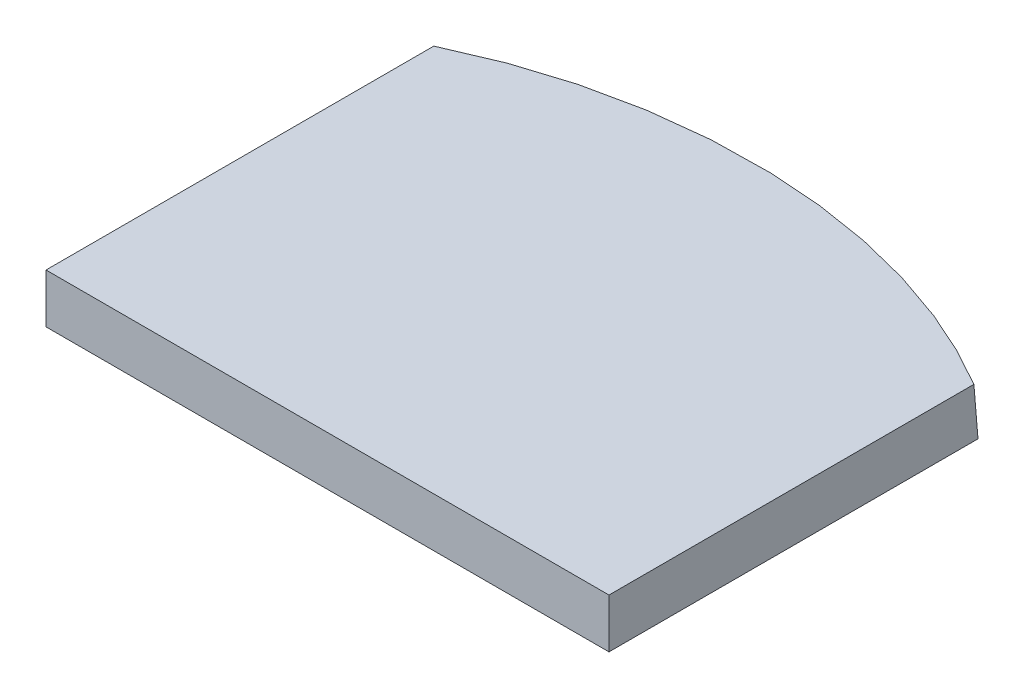
ISO-10303-21;
HEADER;
FILE_DESCRIPTION(('STEP AP214'),'2;1');
FILE_NAME('part.step','',(''),(''),'','','');
FILE_SCHEMA(('AUTOMOTIVE_DESIGN { 1 0 10303 214 1 1 1 1 }'));
ENDSEC;
DATA;
#1=APPLICATION_CONTEXT('core data for automotive mechanical design processes');
#2=APPLICATION_PROTOCOL_DEFINITION('international standard','automotive_design',2000,#1);
#3=PRODUCT_CONTEXT('',#1,'mechanical');
#4=PRODUCT('Part','Part','',(#3));
#5=PRODUCT_RELATED_PRODUCT_CATEGORY('part','',(#4));
#6=PRODUCT_DEFINITION_FORMATION('','',#4);
#7=PRODUCT_DEFINITION_CONTEXT('part definition',#1,'design');
#8=PRODUCT_DEFINITION('design','',#6,#7);
#9=PRODUCT_DEFINITION_SHAPE('','',#8);
#10=(LENGTH_UNIT() NAMED_UNIT(*) SI_UNIT(.MILLI.,.METRE.));
#11=(NAMED_UNIT(*) PLANE_ANGLE_UNIT() SI_UNIT($,.RADIAN.));
#12=(NAMED_UNIT(*) SI_UNIT($,.STERADIAN.) SOLID_ANGLE_UNIT());
#13=UNCERTAINTY_MEASURE_WITH_UNIT(LENGTH_MEASURE(1.E-05),#10,'distance_accuracy_value','');
#14=(GEOMETRIC_REPRESENTATION_CONTEXT(3) GLOBAL_UNCERTAINTY_ASSIGNED_CONTEXT((#13)) GLOBAL_UNIT_ASSIGNED_CONTEXT((#10,
#11,#12)) REPRESENTATION_CONTEXT('',''));
#15=CARTESIAN_POINT('',(0.,0.,0.));
#16=DIRECTION('',(0.,0.,1.));
#17=DIRECTION('',(1.,0.,0.));
#18=AXIS2_PLACEMENT_3D('',#15,#16,#17);
#19=CARTESIAN_POINT('',(21.5,-176.5,20.8978327647945));
#20=DIRECTION('',(-1.,0.,0.));
#21=DIRECTION('',(0.,-1.,0.));
#22=AXIS2_PLACEMENT_3D('',#19,#20,#21);
#23=PLANE('',#22);
#24=CARTESIAN_POINT('',(21.5000000000001,-190.,-26.2183108193915));
#25=CARTESIAN_POINT('',(21.5000000000001,-189.416665155996,-26.169727993826));
#26=CARTESIAN_POINT('',(21.5000000000001,-188.833331067328,-26.1211361023456));
#27=CARTESIAN_POINT('',(21.5,-187.666664400661,-26.0239341875551));
#28=CARTESIAN_POINT('',(21.5,-187.083331822663,-25.975324164245));
#29=CARTESIAN_POINT('',(21.5,-186.5,-25.92670507502));
#30=B_SPLINE_CURVE_WITH_KNOTS('',3,(#24,#25,#26,#27,#28,#29),.UNSPECIFIED.,.F.,.F.,(4,2,4),(0.,
1.7560633468877,3.51212669377542),.UNSPECIFIED.);
#31=CARTESIAN_POINT('',(21.4999994350566,-190.,-26.2183124401896));
#32=VERTEX_POINT('',#31);
#33=CARTESIAN_POINT('',(21.5,-186.5,-25.92670507502));
#34=VERTEX_POINT('',#33);
#35=EDGE_CURVE('E118',#32,#34,#30,.T.);
#36=ORIENTED_EDGE('',*,*,#35,.T.);
#37=DIRECTION('',(0.,0.,-1.));
#38=VECTOR('',#37,1.);
#39=CARTESIAN_POINT('',(21.5,-186.5,20.8978327647945));
#40=LINE('',#39,#38);
#41=CARTESIAN_POINT('',(21.5000000005769,-186.5,0.));
#42=VERTEX_POINT('',#41);
#43=EDGE_CURVE('E11',#42,#34,#40,.T.);
#44=ORIENTED_EDGE('',*,*,#43,.F.);
#45=DIRECTION('',(0.,-1.,0.));
#46=VECTOR('',#45,1.);
#47=CARTESIAN_POINT('',(21.4999999999996,0.,0.));
#48=LINE('',#47,#46);
#49=CARTESIAN_POINT('',(21.5,-190.,0.));
#50=VERTEX_POINT('',#49);
#51=EDGE_CURVE('E48',#42,#50,#48,.T.);
#52=ORIENTED_EDGE('',*,*,#51,.T.);
#53=DIRECTION('',(0.,0.,1.));
#54=VECTOR('',#53,1.);
#55=CARTESIAN_POINT('',(21.5000000000001,-190.,0.));
#56=LINE('',#55,#54);
#57=EDGE_CURVE('E62',#32,#50,#56,.T.);
#58=ORIENTED_EDGE('',*,*,#57,.F.);
#59=EDGE_LOOP('',(#36,#44,#52,#58));
#60=FACE_BOUND('',#59,.T.);
#61=ADVANCED_FACE('F43',(#60),#23,.F.);
#62=CARTESIAN_POINT('',(-18.5,-156.5,21.131836958515));
#63=DIRECTION('',(-1.,0.,0.));
#64=DIRECTION('',(0.,0.,1.));
#65=AXIS2_PLACEMENT_3D('',#62,#63,#64);
#66=PLANE('',#65);
#67=CARTESIAN_POINT('',(-18.5,-190.,-27.8348909743788));
#68=CARTESIAN_POINT('',(-18.5,-188.833333333333,-27.7406024281379));
#69=CARTESIAN_POINT('',(-18.5,-187.666666666667,-27.646313881897));
#70=CARTESIAN_POINT('',(-18.5,-186.5,-27.552025335656));
#71=B_SPLINE_CURVE_WITH_KNOTS('',3,(#67,#68,#69,#70),.UNSPECIFIED.,.F.,.F.,(4,4),(0.,
3.51141181999062),.UNSPECIFIED.);
#72=CARTESIAN_POINT('',(-18.4999996475401,-190.,-27.8348920437937));
#73=VERTEX_POINT('',#72);
#74=CARTESIAN_POINT('',(-18.5,-186.5,-27.552025335656));
#75=VERTEX_POINT('',#74);
#76=EDGE_CURVE('E121',#73,#75,#71,.T.);
#77=ORIENTED_EDGE('',*,*,#76,.F.);
#78=DIRECTION('',(0.,0.,1.));
#79=VECTOR('',#78,1.);
#80=CARTESIAN_POINT('',(-18.5,-190.,0.));
#81=LINE('',#80,#79);
#82=CARTESIAN_POINT('',(-18.5,-190.,0.));
#83=VERTEX_POINT('',#82);
#84=EDGE_CURVE('E101',#73,#83,#81,.T.);
#85=ORIENTED_EDGE('',*,*,#84,.T.);
#86=DIRECTION('',(0.,-1.,0.));
#87=VECTOR('',#86,1.);
#88=CARTESIAN_POINT('',(-18.5,0.,0.));
#89=LINE('',#88,#87);
#90=CARTESIAN_POINT('',(-18.5,-186.5,0.));
#91=VERTEX_POINT('',#90);
#92=EDGE_CURVE('E99',#91,#83,#89,.T.);
#93=ORIENTED_EDGE('',*,*,#92,.F.);
#94=DIRECTION('',(0.,0.,-1.));
#95=VECTOR('',#94,1.);
#96=CARTESIAN_POINT('',(-18.5,-186.5,19.475725904499));
#97=LINE('',#96,#95);
#98=EDGE_CURVE('E81',#91,#75,#97,.T.);
#99=ORIENTED_EDGE('',*,*,#98,.T.);
#100=EDGE_LOOP('',(#77,#85,#93,#99));
#101=FACE_BOUND('',#100,.T.);
#102=ADVANCED_FACE('F105',(#101),#66,.T.);
#103=CARTESIAN_POINT('',(0.,0.,0.));
#104=DIRECTION('',(0.,0.,1.));
#105=DIRECTION('',(1.,0.,0.));
#106=AXIS2_PLACEMENT_3D('',#103,#104,#105);
#107=PLANE('',#106);
#108=ORIENTED_EDGE('',*,*,#92,.T.);
#109=DIRECTION('',(1.,0.,0.));
#110=VECTOR('',#109,1.);
#111=CARTESIAN_POINT('',(0.,-190.,0.));
#112=LINE('',#111,#110);
#113=EDGE_CURVE('E93',#83,#50,#112,.T.);
#114=ORIENTED_EDGE('',*,*,#113,.T.);
#115=ORIENTED_EDGE('',*,*,#51,.F.);
#116=DIRECTION('',(1.,0.,0.));
#117=VECTOR('',#116,1.);
#118=CARTESIAN_POINT('',(0.,-186.5,0.));
#119=LINE('',#118,#117);
#120=EDGE_CURVE('E86',#91,#42,#119,.T.);
#121=ORIENTED_EDGE('',*,*,#120,.F.);
#122=EDGE_LOOP('',(#108,#114,#115,#121));
#123=FACE_BOUND('',#122,.T.);
#124=ADVANCED_FACE('F97',(#123),#107,.T.);
#125=CARTESIAN_POINT('',(0.086150742203567,-186.5,-28.2226236497702));
#126=DIRECTION('',(0.,1.,0.));
#127=DIRECTION('',(0.,0.,1.));
#128=AXIS2_PLACEMENT_3D('',#125,#126,#127);
#129=PLANE('',#128);
#130=CARTESIAN_POINT('',(-18.5,-186.5,-27.552025335656));
#131=CARTESIAN_POINT('',(-17.9834971819987,-186.5,-27.8031883249195));
#132=CARTESIAN_POINT('',(-17.46158288979,-186.5,-28.0430399326112));
#133=CARTESIAN_POINT('',(-16.4080778352532,-186.5,-28.5000670255763));
#134=CARTESIAN_POINT('',(-15.8764896431985,-186.5,-28.7172484337435));
#135=CARTESIAN_POINT('',(-14.2691295982034,-186.5,-29.3346626366866));
#136=CARTESIAN_POINT('',(-13.1801752516849,-186.5,-29.7010497160131));
#137=CARTESIAN_POINT('',(-10.9765888879245,-186.5,-30.3430838196725));
#138=CARTESIAN_POINT('',(-9.86197162574349,-186.5,-30.6187816579454));
#139=CARTESIAN_POINT('',(-8.17622120811546,-186.5,-30.9645975513845));
#140=CARTESIAN_POINT('',(-7.61185066737096,-186.5,-31.0685994012236));
#141=CARTESIAN_POINT('',(-6.47928085674553,-186.5,-31.2540516079508));
#142=CARTESIAN_POINT('',(-5.91108071822283,-186.5,-31.3354966591282));
#143=CARTESIAN_POINT('',(-4.17954070251019,-186.5,-31.5487701514934));
#144=CARTESIAN_POINT('',(-3.01163026901751,-186.5,-31.644944999237));
#145=CARTESIAN_POINT('',(-0.671827155307275,-186.5,-31.7434024046366));
#146=CARTESIAN_POINT('',(0.500065662985438,-186.5,-31.7456816728824));
#147=CARTESIAN_POINT('',(2.25483993137703,-186.5,-31.678728496834));
#148=CARTESIAN_POINT('',(2.83924686846808,-186.5,-31.6446829222743));
#149=CARTESIAN_POINT('',(4.00607310275159,-186.5,-31.5531403371392));
#150=CARTESIAN_POINT('',(4.58849295282674,-186.5,-31.4956504970563));
#151=CARTESIAN_POINT('',(5.75056259078612,-186.5,-31.3572029737904));
#152=CARTESIAN_POINT('',(6.33021226638889,-186.5,-31.2762443474282));
#153=CARTESIAN_POINT('',(7.48589273767048,-186.5,-31.0908261739034));
#154=CARTESIAN_POINT('',(8.0619223679602,-186.5,-30.9863594209952));
#155=CARTESIAN_POINT('',(9.76534074123102,-186.5,-30.6412399040868));
#156=CARTESIAN_POINT('',(10.8860612762541,-186.5,-30.3667208242584));
#157=CARTESIAN_POINT('',(13.1011223398577,-186.5,-29.7263534466765));
#158=CARTESIAN_POINT('',(14.1954644150943,-186.5,-29.3605105178949));
#159=CARTESIAN_POINT('',(15.8116745315898,-186.5,-28.7430031025506));
#160=CARTESIAN_POINT('',(16.3467646670301,-186.5,-28.5254347696975));
#161=CARTESIAN_POINT('',(17.4069299603634,-186.5,-28.0674838205188));
#162=CARTESIAN_POINT('',(17.9320082904271,-186.5,-27.8271085796644));
#163=CARTESIAN_POINT('',(18.9714279268183,-186.5,-27.3233945831971));
#164=CARTESIAN_POINT('',(19.4857625177313,-186.5,-27.0600419681749));
#165=CARTESIAN_POINT('',(20.5023263980185,-186.5,-26.5104802575293));
#166=CARTESIAN_POINT('',(21.0045509023033,-186.5,-26.2242623136694));
#167=CARTESIAN_POINT('',(21.5,-186.5,-25.92670507502));
#168=B_SPLINE_CURVE_WITH_KNOTS('',3,(#130,#131,#132,#133,#134,#135,#136,#137,#138,#139,#140,
#141,#142,#143,#144,#145,#146,#147,#148,#149,#150,#151,#152,#153,#154,#155,#156,#157,#158,#159,
#160,#161,#162,#163,#164,#165,#166,#167),.UNSPECIFIED.,.F.,.F.,(4,2,2,2,2,2,2,2,2,2,2,2,2,2,2,2,
2,2,4),(0.,1.72271175500686,3.44497229597351,6.88754309320038,10.3281816905251,12.0494029617527,
13.7710287478836,17.2825861900795,20.7942666513057,22.5500647550949,24.3053262455264,
26.0606582873434,27.8165291107941,31.2740433265453,34.7313543212678,36.463798653247,
38.1956846314571,39.9286225612644,41.6622343679961),.UNSPECIFIED.);
#169=EDGE_CURVE('E88',#75,#34,#168,.T.);
#170=ORIENTED_EDGE('',*,*,#169,.F.);
#171=ORIENTED_EDGE('',*,*,#98,.F.);
#172=ORIENTED_EDGE('',*,*,#120,.T.);
#173=ORIENTED_EDGE('',*,*,#43,.T.);
#174=EDGE_LOOP('',(#170,#171,#172,#173));
#175=FACE_BOUND('',#174,.T.);
#176=ADVANCED_FACE('F82',(#175),#129,.T.);
#177=CARTESIAN_POINT('',(-0.0942476803876341,-190.,31.9998989353041));
#178=CARTESIAN_POINT('',(0.,0.,17.5));
#179=CARTESIAN_POINT('',(0.000942476803874733,1.9,17.355001010647));
#180=CARTESIAN_POINT('',(74.9055154492315,-190.,32.1607483098324));
#181=CARTESIAN_POINT('',(52.,0.,17.5));
#182=CARTESIAN_POINT('',(51.7709448455077,1.9,17.3533925169017));
#183=CARTESIAN_POINT('',(75.0940108100067,-190.,-31.839049560776));
#184=CARTESIAN_POINT('',(52.,0.,-17.5));
#185=CARTESIAN_POINT('',(51.7690598918999,1.9,-17.3566095043922));
#186=CARTESIAN_POINT('',(0.0942476803875962,-190.,-31.9998989353041));
#187=CARTESIAN_POINT('',(0.,0.,-17.5));
#188=CARTESIAN_POINT('',(-0.000942476803871138,1.9,-17.355001010647));
#189=CARTESIAN_POINT('',(-74.9055154492314,-190.,-32.1607483098323));
#190=CARTESIAN_POINT('',(-52.,0.,-17.5));
#191=CARTESIAN_POINT('',(-51.7709448455077,1.9,-17.3533925169017));
#192=CARTESIAN_POINT('',(-75.0940108100066,-190.,31.839049560776));
#193=CARTESIAN_POINT('',(-52.,0.,17.5));
#194=CARTESIAN_POINT('',(-51.7690598918999,1.9,17.3566095043922));
#195=CARTESIAN_POINT('',(-0.0942476803876341,-190.,31.9998989353041));
#196=CARTESIAN_POINT('',(0.,0.,17.5));
#197=CARTESIAN_POINT('',(0.000942476803874733,1.9,17.355001010647));
#198=(BOUNDED_SURFACE() B_SPLINE_SURFACE(3,1,((#177,#178,#179),(#180,#181,#182),(#183,#184,
#185),(#186,#187,#188),(#189,#190,#191),(#192,#193,#194),(#195,#196,#197)),.UNSPECIFIED.,.T.,
.F.,.F.) B_SPLINE_SURFACE_WITH_KNOTS((4,3,4),(2,1,2),(0.,0.5,1.),(0.,1.,1.01),
.UNSPECIFIED.) GEOMETRIC_REPRESENTATION_ITEM() RATIONAL_B_SPLINE_SURFACE(((1.,1.,1.),
(0.333333333333333,0.333333333333333,0.333333333333333),(0.333333333333333,0.333333333333333,
0.333333333333333),(1.,1.,1.),(0.333333333333333,0.333333333333333,0.333333333333333),
(0.333333333333333,0.333333333333333,0.333333333333333),(1.,1.,1.))) REPRESENTATION_ITEM('') SURFACE());
#199=CARTESIAN_POINT('',(0.,-190.,0.));
#200=DIRECTION('',(0.,1.,0.));
#201=DIRECTION('',(1.,0.,0.));
#202=AXIS2_PLACEMENT_3D('',#199,#200,#201);
#203=ELLIPSE('',#202,37.5,32.);
#204=EDGE_CURVE('E52',#32,#73,#203,.T.);
#205=ORIENTED_EDGE('',*,*,#35,.F.);
#206=ORIENTED_EDGE('',*,*,#204,.T.);
#207=ORIENTED_EDGE('',*,*,#76,.T.);
#208=ORIENTED_EDGE('',*,*,#169,.T.);
#209=EDGE_LOOP('',(#205,#206,#207,#208));
#210=FACE_BOUND('',#209,.T.);
#211=ADVANCED_FACE('F132',(#210),#198,.T.);
#212=CARTESIAN_POINT('',(0.,-190.,0.));
#213=DIRECTION('',(0.,1.,0.));
#214=DIRECTION('',(0.,0.,1.));
#215=AXIS2_PLACEMENT_3D('',#212,#213,#214);
#216=PLANE('',#215);
#217=ORIENTED_EDGE('',*,*,#204,.F.);
#218=ORIENTED_EDGE('',*,*,#57,.T.);
#219=ORIENTED_EDGE('',*,*,#113,.F.);
#220=ORIENTED_EDGE('',*,*,#84,.F.);
#221=EDGE_LOOP('',(#217,#218,#219,#220));
#222=FACE_BOUND('',#221,.T.);
#223=ADVANCED_FACE('F44',(#222),#216,.F.);
#224=CLOSED_SHELL('',(#61,#102,#124,#176,#211,#223));
#225=MANIFOLD_SOLID_BREP('B2',#224);
#226=ADVANCED_BREP_SHAPE_REPRESENTATION('',(#18,#225),#14);
#227=SHAPE_DEFINITION_REPRESENTATION(#9,#226);
ENDSEC;
END-ISO-10303-21;
